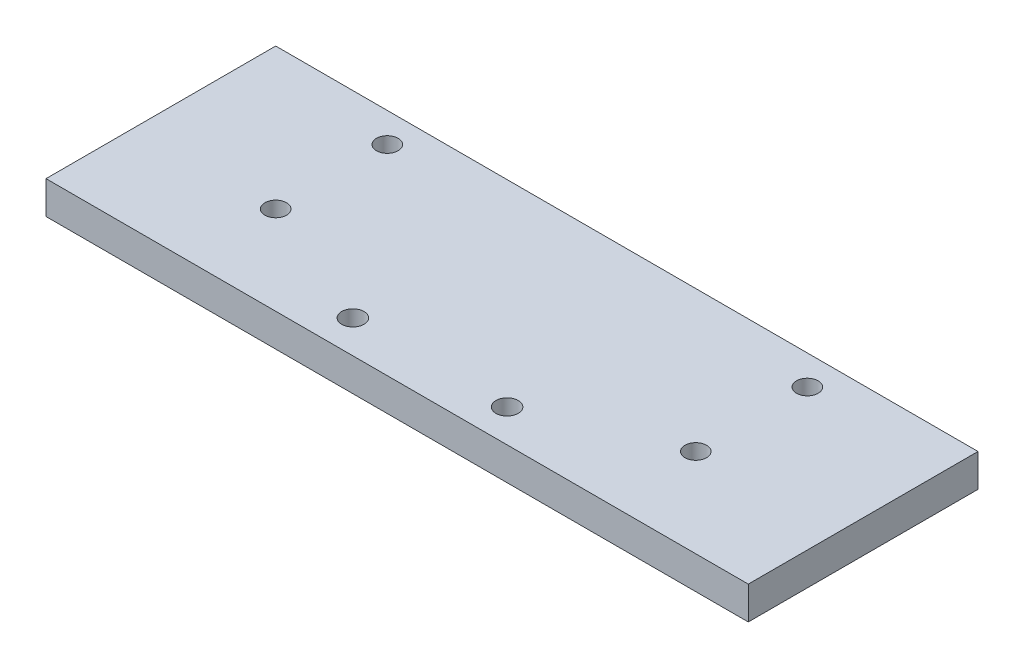
ISO-10303-21;
HEADER;
FILE_DESCRIPTION(('STEP AP214'),'2;1');
FILE_NAME('part.step','',(''),(''),'','','');
FILE_SCHEMA(('AUTOMOTIVE_DESIGN { 1 0 10303 214 1 1 1 1 }'));
ENDSEC;
DATA;
#1=APPLICATION_CONTEXT('core data for automotive mechanical design processes');
#2=APPLICATION_PROTOCOL_DEFINITION('international standard','automotive_design',2000,#1);
#3=PRODUCT_CONTEXT('',#1,'mechanical');
#4=PRODUCT('Part','Part','',(#3));
#5=PRODUCT_RELATED_PRODUCT_CATEGORY('part','',(#4));
#6=PRODUCT_DEFINITION_FORMATION('','',#4);
#7=PRODUCT_DEFINITION_CONTEXT('part definition',#1,'design');
#8=PRODUCT_DEFINITION('design','',#6,#7);
#9=PRODUCT_DEFINITION_SHAPE('','',#8);
#10=(LENGTH_UNIT() NAMED_UNIT(*) SI_UNIT(.MILLI.,.METRE.));
#11=(NAMED_UNIT(*) PLANE_ANGLE_UNIT() SI_UNIT($,.RADIAN.));
#12=(NAMED_UNIT(*) SI_UNIT($,.STERADIAN.) SOLID_ANGLE_UNIT());
#13=UNCERTAINTY_MEASURE_WITH_UNIT(LENGTH_MEASURE(1.E-05),#10,'distance_accuracy_value','');
#14=(GEOMETRIC_REPRESENTATION_CONTEXT(3) GLOBAL_UNCERTAINTY_ASSIGNED_CONTEXT((#13)) GLOBAL_UNIT_ASSIGNED_CONTEXT((#10,
#11,#12)) REPRESENTATION_CONTEXT('',''));
#15=CARTESIAN_POINT('',(0.,0.,0.));
#16=DIRECTION('',(0.,0.,1.));
#17=DIRECTION('',(1.,0.,0.));
#18=AXIS2_PLACEMENT_3D('',#15,#16,#17);
#19=CARTESIAN_POINT('',(0.,5.,0.));
#20=DIRECTION('',(0.,1.,0.));
#21=DIRECTION('',(0.,0.,1.));
#22=AXIS2_PLACEMENT_3D('',#19,#20,#21);
#23=PLANE('',#22);
#24=CARTESIAN_POINT('',(51.0503144654088,5.,-8.98270440251569));
#25=DIRECTION('',(0.,-1.,0.));
#26=DIRECTION('',(0.,0.,-1.));
#27=AXIS2_PLACEMENT_3D('',#24,#25,#26);
#28=CIRCLE('',#27,1.65);
#29=CARTESIAN_POINT('',(51.0503144654088,5.,-10.6327044025157));
#30=VERTEX_POINT('',#29);
#31=EDGE_CURVE('E133',#30,#30,#28,.T.);
#32=ORIENTED_EDGE('',*,*,#31,.T.);
#33=EDGE_LOOP('',(#32));
#34=FACE_BOUND('',#33,.T.);
#35=CARTESIAN_POINT('',(-12.9496855345912,5.,-8.98270440251569));
#36=DIRECTION('',(0.,1.,0.));
#37=DIRECTION('',(0.,0.,1.));
#38=AXIS2_PLACEMENT_3D('',#35,#36,#37);
#39=CIRCLE('',#38,1.65);
#40=CARTESIAN_POINT('',(-12.9496855345912,5.,-7.33270440251569));
#41=VERTEX_POINT('',#40);
#42=EDGE_CURVE('E139',#41,#41,#39,.T.);
#43=ORIENTED_EDGE('',*,*,#42,.F.);
#44=EDGE_LOOP('',(#43));
#45=FACE_BOUND('',#44,.T.);
#46=DIRECTION('',(0.,0.,1.));
#47=VECTOR('',#46,1.);
#48=CARTESIAN_POINT('',(-34.4496855345912,5.,-13.4827044025157));
#49=LINE('',#48,#47);
#50=CARTESIAN_POINT('',(-34.4496855345912,5.,-13.4827044025157));
#51=VERTEX_POINT('',#50);
#52=CARTESIAN_POINT('',(-34.4496855345912,5.,21.5172955974843));
#53=VERTEX_POINT('',#52);
#54=EDGE_CURVE('E86',#51,#53,#49,.T.);
#55=ORIENTED_EDGE('',*,*,#54,.T.);
#56=DIRECTION('',(1.,0.,0.));
#57=VECTOR('',#56,1.);
#58=CARTESIAN_POINT('',(-34.4496855345912,5.,21.5172955974843));
#59=LINE('',#58,#57);
#60=CARTESIAN_POINT('',(72.5503144654088,5.,21.5172955974843));
#61=VERTEX_POINT('',#60);
#62=EDGE_CURVE('E78',#53,#61,#59,.T.);
#63=ORIENTED_EDGE('',*,*,#62,.T.);
#64=DIRECTION('',(0.,0.,1.));
#65=VECTOR('',#64,1.);
#66=CARTESIAN_POINT('',(72.5503144654088,5.,-13.4827044025157));
#67=LINE('',#66,#65);
#68=CARTESIAN_POINT('',(72.5503144654088,5.,-13.4827044025157));
#69=VERTEX_POINT('',#68);
#70=EDGE_CURVE('E85',#69,#61,#67,.T.);
#71=ORIENTED_EDGE('',*,*,#70,.F.);
#72=DIRECTION('',(1.,0.,0.));
#73=VECTOR('',#72,1.);
#74=CARTESIAN_POINT('',(-34.4496855345912,5.,-13.4827044025157));
#75=LINE('',#74,#73);
#76=EDGE_CURVE('E95',#51,#69,#75,.T.);
#77=ORIENTED_EDGE('',*,*,#76,.F.);
#78=EDGE_LOOP('',(#55,#63,#71,#77));
#79=FACE_BOUND('',#78,.T.);
#80=CARTESIAN_POINT('',(7.30031446540879,5.,16.5172955974843));
#81=DIRECTION('',(0.,1.,0.));
#82=DIRECTION('',(0.,0.,1.));
#83=AXIS2_PLACEMENT_3D('',#80,#81,#82);
#84=CIRCLE('',#83,1.7);
#85=CARTESIAN_POINT('',(7.30031446540879,5.,18.2172955974843));
#86=VERTEX_POINT('',#85);
#87=EDGE_CURVE('E112',#86,#86,#84,.T.);
#88=ORIENTED_EDGE('',*,*,#87,.F.);
#89=EDGE_LOOP('',(#88));
#90=FACE_BOUND('',#89,.T.);
#91=CARTESIAN_POINT('',(-12.9496855345912,5.,8.01729559748431));
#92=DIRECTION('',(0.,-1.,0.));
#93=DIRECTION('',(0.,0.,-1.));
#94=AXIS2_PLACEMENT_3D('',#91,#92,#93);
#95=CIRCLE('',#94,1.65);
#96=CARTESIAN_POINT('',(-12.9496855345912,5.,6.36729559748431));
#97=VERTEX_POINT('',#96);
#98=EDGE_CURVE('E115',#97,#97,#95,.T.);
#99=ORIENTED_EDGE('',*,*,#98,.T.);
#100=EDGE_LOOP('',(#99));
#101=FACE_BOUND('',#100,.T.);
#102=CARTESIAN_POINT('',(51.0503144654088,5.,8.01729559748431));
#103=DIRECTION('',(0.,1.,0.));
#104=DIRECTION('',(0.,0.,1.));
#105=AXIS2_PLACEMENT_3D('',#102,#103,#104);
#106=CIRCLE('',#105,1.65);
#107=CARTESIAN_POINT('',(51.0503144654088,5.,9.6672955974843));
#108=VERTEX_POINT('',#107);
#109=EDGE_CURVE('E127',#108,#108,#106,.T.);
#110=ORIENTED_EDGE('',*,*,#109,.F.);
#111=EDGE_LOOP('',(#110));
#112=FACE_BOUND('',#111,.T.);
#113=CARTESIAN_POINT('',(30.8003144654088,5.,16.5172955974843));
#114=DIRECTION('',(0.,-1.,0.));
#115=DIRECTION('',(0.,0.,-1.));
#116=AXIS2_PLACEMENT_3D('',#113,#114,#115);
#117=CIRCLE('',#116,1.7);
#118=CARTESIAN_POINT('',(30.8003144654088,5.,14.8172955974843));
#119=VERTEX_POINT('',#118);
#120=EDGE_CURVE('E121',#119,#119,#117,.T.);
#121=ORIENTED_EDGE('',*,*,#120,.T.);
#122=EDGE_LOOP('',(#121));
#123=FACE_BOUND('',#122,.T.);
#124=ADVANCED_FACE('F36',(#34,#45,#79,#90,#101,#112,#123),#23,.T.);
#125=CARTESIAN_POINT('',(0.,0.,0.));
#126=DIRECTION('',(0.,1.,0.));
#127=DIRECTION('',(0.,0.,1.));
#128=AXIS2_PLACEMENT_3D('',#125,#126,#127);
#129=PLANE('',#128);
#130=CARTESIAN_POINT('',(51.0503144654088,0.,8.01729559748431));
#131=DIRECTION('',(0.,1.,0.));
#132=DIRECTION('',(0.,0.,1.));
#133=AXIS2_PLACEMENT_3D('',#130,#131,#132);
#134=CIRCLE('',#133,1.65);
#135=CARTESIAN_POINT('',(51.0503144654088,0.,9.6672955974843));
#136=VERTEX_POINT('',#135);
#137=EDGE_CURVE('E124',#136,#136,#134,.T.);
#138=ORIENTED_EDGE('',*,*,#137,.T.);
#139=EDGE_LOOP('',(#138));
#140=FACE_BOUND('',#139,.T.);
#141=CARTESIAN_POINT('',(-12.9496855345912,0.,-8.98270440251569));
#142=DIRECTION('',(0.,1.,0.));
#143=DIRECTION('',(0.,0.,1.));
#144=AXIS2_PLACEMENT_3D('',#141,#142,#143);
#145=CIRCLE('',#144,1.65);
#146=CARTESIAN_POINT('',(-12.9496855345912,0.,-7.33270440251569));
#147=VERTEX_POINT('',#146);
#148=EDGE_CURVE('E136',#147,#147,#145,.T.);
#149=ORIENTED_EDGE('',*,*,#148,.T.);
#150=EDGE_LOOP('',(#149));
#151=FACE_BOUND('',#150,.T.);
#152=CARTESIAN_POINT('',(7.30031446540879,0.,16.5172955974843));
#153=DIRECTION('',(0.,1.,0.));
#154=DIRECTION('',(0.,0.,1.));
#155=AXIS2_PLACEMENT_3D('',#152,#153,#154);
#156=CIRCLE('',#155,1.7);
#157=CARTESIAN_POINT('',(7.30031446540879,0.,18.2172955974843));
#158=VERTEX_POINT('',#157);
#159=EDGE_CURVE('E102',#158,#158,#156,.T.);
#160=ORIENTED_EDGE('',*,*,#159,.T.);
#161=EDGE_LOOP('',(#160));
#162=FACE_BOUND('',#161,.T.);
#163=DIRECTION('',(0.,0.,1.));
#164=VECTOR('',#163,1.);
#165=CARTESIAN_POINT('',(-34.4496855345912,0.,-13.4827044025157));
#166=LINE('',#165,#164);
#167=CARTESIAN_POINT('',(-34.4496855345912,0.,-13.4827044025157));
#168=VERTEX_POINT('',#167);
#169=CARTESIAN_POINT('',(-34.4496855345912,0.,21.5172955974843));
#170=VERTEX_POINT('',#169);
#171=EDGE_CURVE('E100',#168,#170,#166,.T.);
#172=ORIENTED_EDGE('',*,*,#171,.F.);
#173=DIRECTION('',(1.,0.,0.));
#174=VECTOR('',#173,1.);
#175=CARTESIAN_POINT('',(-34.4496855345912,0.,-13.4827044025157));
#176=LINE('',#175,#174);
#177=CARTESIAN_POINT('',(72.5503144654088,0.,-13.4827044025157));
#178=VERTEX_POINT('',#177);
#179=EDGE_CURVE('E106',#168,#178,#176,.T.);
#180=ORIENTED_EDGE('',*,*,#179,.T.);
#181=DIRECTION('',(0.,0.,1.));
#182=VECTOR('',#181,1.);
#183=CARTESIAN_POINT('',(72.5503144654088,0.,-13.4827044025157));
#184=LINE('',#183,#182);
#185=CARTESIAN_POINT('',(72.5503144654088,0.,21.5172955974843));
#186=VERTEX_POINT('',#185);
#187=EDGE_CURVE('E104',#178,#186,#184,.T.);
#188=ORIENTED_EDGE('',*,*,#187,.T.);
#189=DIRECTION('',(1.,0.,0.));
#190=VECTOR('',#189,1.);
#191=CARTESIAN_POINT('',(-34.4496855345912,0.,21.5172955974843));
#192=LINE('',#191,#190);
#193=EDGE_CURVE('E91',#170,#186,#192,.T.);
#194=ORIENTED_EDGE('',*,*,#193,.F.);
#195=EDGE_LOOP('',(#172,#180,#188,#194));
#196=FACE_BOUND('',#195,.T.);
#197=CARTESIAN_POINT('',(-12.9496855345912,0.,8.01729559748431));
#198=DIRECTION('',(0.,-1.,0.));
#199=DIRECTION('',(0.,0.,-1.));
#200=AXIS2_PLACEMENT_3D('',#197,#198,#199);
#201=CIRCLE('',#200,1.65);
#202=CARTESIAN_POINT('',(-12.9496855345912,0.,6.36729559748431));
#203=VERTEX_POINT('',#202);
#204=EDGE_CURVE('E142',#203,#203,#201,.T.);
#205=ORIENTED_EDGE('',*,*,#204,.F.);
#206=EDGE_LOOP('',(#205));
#207=FACE_BOUND('',#206,.T.);
#208=CARTESIAN_POINT('',(51.0503144654088,0.,-8.98270440251569));
#209=DIRECTION('',(0.,-1.,0.));
#210=DIRECTION('',(0.,0.,-1.));
#211=AXIS2_PLACEMENT_3D('',#208,#209,#210);
#212=CIRCLE('',#211,1.65);
#213=CARTESIAN_POINT('',(51.0503144654088,0.,-10.6327044025157));
#214=VERTEX_POINT('',#213);
#215=EDGE_CURVE('E130',#214,#214,#212,.T.);
#216=ORIENTED_EDGE('',*,*,#215,.F.);
#217=EDGE_LOOP('',(#216));
#218=FACE_BOUND('',#217,.T.);
#219=CARTESIAN_POINT('',(30.8003144654088,0.,16.5172955974843));
#220=DIRECTION('',(0.,-1.,0.));
#221=DIRECTION('',(0.,0.,-1.));
#222=AXIS2_PLACEMENT_3D('',#219,#220,#221);
#223=CIRCLE('',#222,1.7);
#224=CARTESIAN_POINT('',(30.8003144654088,0.,14.8172955974843));
#225=VERTEX_POINT('',#224);
#226=EDGE_CURVE('E118',#225,#225,#223,.T.);
#227=ORIENTED_EDGE('',*,*,#226,.F.);
#228=EDGE_LOOP('',(#227));
#229=FACE_BOUND('',#228,.T.);
#230=ADVANCED_FACE('F167',(#140,#151,#162,#196,#207,#218,#229),#129,.F.);
#231=CARTESIAN_POINT('',(-34.4496855345912,5.,-13.4827044025157));
#232=DIRECTION('',(1.,0.,0.));
#233=DIRECTION('',(0.,0.,-1.));
#234=AXIS2_PLACEMENT_3D('',#231,#232,#233);
#235=PLANE('',#234);
#236=ORIENTED_EDGE('',*,*,#171,.T.);
#237=DIRECTION('',(0.,-1.,0.));
#238=VECTOR('',#237,1.);
#239=CARTESIAN_POINT('',(-34.4496855345912,5.,21.5172955974843));
#240=LINE('',#239,#238);
#241=EDGE_CURVE('E11',#53,#170,#240,.T.);
#242=ORIENTED_EDGE('',*,*,#241,.F.);
#243=ORIENTED_EDGE('',*,*,#54,.F.);
#244=DIRECTION('',(0.,-1.,0.));
#245=VECTOR('',#244,1.);
#246=CARTESIAN_POINT('',(-34.4496855345912,5.,-13.4827044025157));
#247=LINE('',#246,#245);
#248=EDGE_CURVE('E53',#51,#168,#247,.T.);
#249=ORIENTED_EDGE('',*,*,#248,.T.);
#250=EDGE_LOOP('',(#236,#242,#243,#249));
#251=FACE_BOUND('',#250,.T.);
#252=ADVANCED_FACE('F38',(#251),#235,.F.);
#253=CARTESIAN_POINT('',(-34.4496855345912,5.,21.5172955974843));
#254=DIRECTION('',(0.,0.,-1.));
#255=DIRECTION('',(-1.,0.,0.));
#256=AXIS2_PLACEMENT_3D('',#253,#254,#255);
#257=PLANE('',#256);
#258=ORIENTED_EDGE('',*,*,#193,.T.);
#259=DIRECTION('',(0.,-1.,0.));
#260=VECTOR('',#259,1.);
#261=CARTESIAN_POINT('',(72.5503144654088,5.,21.5172955974843));
#262=LINE('',#261,#260);
#263=EDGE_CURVE('E45',#61,#186,#262,.T.);
#264=ORIENTED_EDGE('',*,*,#263,.F.);
#265=ORIENTED_EDGE('',*,*,#62,.F.);
#266=ORIENTED_EDGE('',*,*,#241,.T.);
#267=EDGE_LOOP('',(#258,#264,#265,#266));
#268=FACE_BOUND('',#267,.T.);
#269=ADVANCED_FACE('F90',(#268),#257,.F.);
#270=CARTESIAN_POINT('',(72.5503144654088,5.,-13.4827044025157));
#271=DIRECTION('',(1.,0.,0.));
#272=DIRECTION('',(0.,0.,-1.));
#273=AXIS2_PLACEMENT_3D('',#270,#271,#272);
#274=PLANE('',#273);
#275=ORIENTED_EDGE('',*,*,#187,.F.);
#276=DIRECTION('',(0.,-1.,0.));
#277=VECTOR('',#276,1.);
#278=CARTESIAN_POINT('',(72.5503144654088,5.,-13.4827044025157));
#279=LINE('',#278,#277);
#280=EDGE_CURVE('E67',#69,#178,#279,.T.);
#281=ORIENTED_EDGE('',*,*,#280,.F.);
#282=ORIENTED_EDGE('',*,*,#70,.T.);
#283=ORIENTED_EDGE('',*,*,#263,.T.);
#284=EDGE_LOOP('',(#275,#281,#282,#283));
#285=FACE_BOUND('',#284,.T.);
#286=ADVANCED_FACE('F94',(#285),#274,.T.);
#287=CARTESIAN_POINT('',(-34.4496855345912,5.,-13.4827044025157));
#288=DIRECTION('',(0.,0.,-1.));
#289=DIRECTION('',(-1.,0.,0.));
#290=AXIS2_PLACEMENT_3D('',#287,#288,#289);
#291=PLANE('',#290);
#292=ORIENTED_EDGE('',*,*,#179,.F.);
#293=ORIENTED_EDGE('',*,*,#248,.F.);
#294=ORIENTED_EDGE('',*,*,#76,.T.);
#295=ORIENTED_EDGE('',*,*,#280,.T.);
#296=EDGE_LOOP('',(#292,#293,#294,#295));
#297=FACE_BOUND('',#296,.T.);
#298=ADVANCED_FACE('F163',(#297),#291,.T.);
#299=CARTESIAN_POINT('',(7.30031446540879,0.,16.5172955974843));
#300=DIRECTION('',(0.,1.,0.));
#301=DIRECTION('',(0.,0.,1.));
#302=AXIS2_PLACEMENT_3D('',#299,#300,#301);
#303=CYLINDRICAL_SURFACE('',#302,1.7);
#304=ORIENTED_EDGE('',*,*,#159,.F.);
#305=EDGE_LOOP('',(#304));
#306=FACE_BOUND('',#305,.T.);
#307=ORIENTED_EDGE('',*,*,#87,.T.);
#308=EDGE_LOOP('',(#307));
#309=FACE_BOUND('',#308,.T.);
#310=ADVANCED_FACE('F153',(#306,#309),#303,.F.);
#311=CARTESIAN_POINT('',(-12.9496855345912,0.,8.01729559748431));
#312=DIRECTION('',(0.,1.,0.));
#313=DIRECTION('',(0.,0.,1.));
#314=AXIS2_PLACEMENT_3D('',#311,#312,#313);
#315=CYLINDRICAL_SURFACE('',#314,1.65);
#316=ORIENTED_EDGE('',*,*,#204,.T.);
#317=EDGE_LOOP('',(#316));
#318=FACE_BOUND('',#317,.T.);
#319=ORIENTED_EDGE('',*,*,#98,.F.);
#320=EDGE_LOOP('',(#319));
#321=FACE_BOUND('',#320,.T.);
#322=ADVANCED_FACE('F150',(#318,#321),#315,.F.);
#323=CARTESIAN_POINT('',(-12.9496855345912,0.,-8.98270440251569));
#324=DIRECTION('',(0.,1.,0.));
#325=DIRECTION('',(0.,0.,1.));
#326=AXIS2_PLACEMENT_3D('',#323,#324,#325);
#327=CYLINDRICAL_SURFACE('',#326,1.65);
#328=ORIENTED_EDGE('',*,*,#148,.F.);
#329=EDGE_LOOP('',(#328));
#330=FACE_BOUND('',#329,.T.);
#331=ORIENTED_EDGE('',*,*,#42,.T.);
#332=EDGE_LOOP('',(#331));
#333=FACE_BOUND('',#332,.T.);
#334=ADVANCED_FACE('F152',(#330,#333),#327,.F.);
#335=CARTESIAN_POINT('',(51.0503144654088,0.,-8.98270440251569));
#336=DIRECTION('',(0.,1.,0.));
#337=DIRECTION('',(0.,0.,1.));
#338=AXIS2_PLACEMENT_3D('',#335,#336,#337);
#339=CYLINDRICAL_SURFACE('',#338,1.65);
#340=ORIENTED_EDGE('',*,*,#215,.T.);
#341=EDGE_LOOP('',(#340));
#342=FACE_BOUND('',#341,.T.);
#343=ORIENTED_EDGE('',*,*,#31,.F.);
#344=EDGE_LOOP('',(#343));
#345=FACE_BOUND('',#344,.T.);
#346=ADVANCED_FACE('F160',(#342,#345),#339,.F.);
#347=CARTESIAN_POINT('',(51.0503144654088,0.,8.01729559748431));
#348=DIRECTION('',(0.,1.,0.));
#349=DIRECTION('',(0.,0.,1.));
#350=AXIS2_PLACEMENT_3D('',#347,#348,#349);
#351=CYLINDRICAL_SURFACE('',#350,1.65);
#352=ORIENTED_EDGE('',*,*,#137,.F.);
#353=EDGE_LOOP('',(#352));
#354=FACE_BOUND('',#353,.T.);
#355=ORIENTED_EDGE('',*,*,#109,.T.);
#356=EDGE_LOOP('',(#355));
#357=FACE_BOUND('',#356,.T.);
#358=ADVANCED_FACE('F197',(#354,#357),#351,.F.);
#359=CARTESIAN_POINT('',(30.8003144654088,0.,16.5172955974843));
#360=DIRECTION('',(0.,1.,0.));
#361=DIRECTION('',(0.,0.,1.));
#362=AXIS2_PLACEMENT_3D('',#359,#360,#361);
#363=CYLINDRICAL_SURFACE('',#362,1.7);
#364=ORIENTED_EDGE('',*,*,#226,.T.);
#365=EDGE_LOOP('',(#364));
#366=FACE_BOUND('',#365,.T.);
#367=ORIENTED_EDGE('',*,*,#120,.F.);
#368=EDGE_LOOP('',(#367));
#369=FACE_BOUND('',#368,.T.);
#370=ADVANCED_FACE('F194',(#366,#369),#363,.F.);
#371=CLOSED_SHELL('',(#124,#230,#252,#269,#286,#298,#310,#322,#334,#346,#358,#370));
#372=MANIFOLD_SOLID_BREP('B2',#371);
#373=ADVANCED_BREP_SHAPE_REPRESENTATION('',(#18,#372),#14);
#374=SHAPE_DEFINITION_REPRESENTATION(#9,#373);
ENDSEC;
END-ISO-10303-21;
